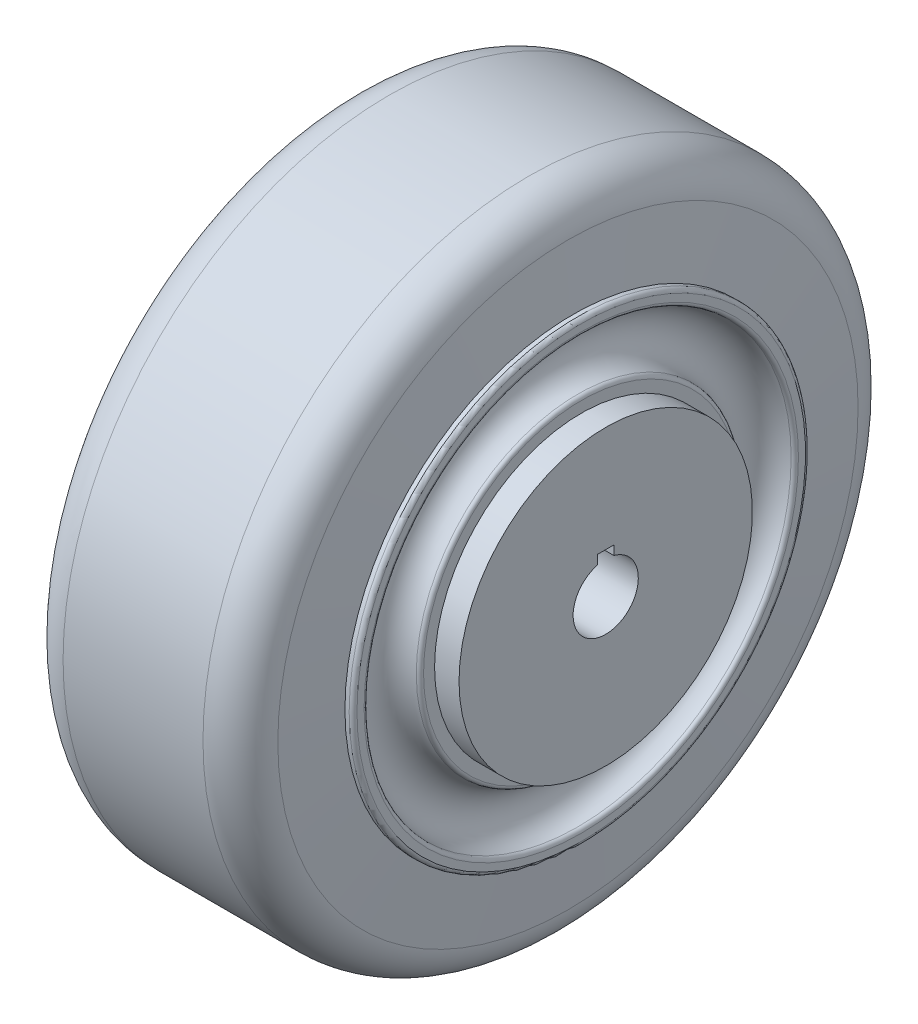
ISO-10303-21;
HEADER;
FILE_DESCRIPTION(('STEP AP214'),'2;1');
FILE_NAME('part.step','',(''),(''),'','','');
FILE_SCHEMA(('AUTOMOTIVE_DESIGN { 1 0 10303 214 1 1 1 1 }'));
ENDSEC;
DATA;
#1=APPLICATION_CONTEXT('core data for automotive mechanical design processes');
#2=APPLICATION_PROTOCOL_DEFINITION('international standard','automotive_design',2000,#1);
#3=PRODUCT_CONTEXT('',#1,'mechanical');
#4=PRODUCT('Part','Part','',(#3));
#5=PRODUCT_RELATED_PRODUCT_CATEGORY('part','',(#4));
#6=PRODUCT_DEFINITION_FORMATION('','',#4);
#7=PRODUCT_DEFINITION_CONTEXT('part definition',#1,'design');
#8=PRODUCT_DEFINITION('design','',#6,#7);
#9=PRODUCT_DEFINITION_SHAPE('','',#8);
#10=(LENGTH_UNIT() NAMED_UNIT(*) SI_UNIT(.MILLI.,.METRE.));
#11=(NAMED_UNIT(*) PLANE_ANGLE_UNIT() SI_UNIT($,.RADIAN.));
#12=(NAMED_UNIT(*) SI_UNIT($,.STERADIAN.) SOLID_ANGLE_UNIT());
#13=UNCERTAINTY_MEASURE_WITH_UNIT(LENGTH_MEASURE(1.E-05),#10,'distance_accuracy_value','');
#14=(GEOMETRIC_REPRESENTATION_CONTEXT(3) GLOBAL_UNCERTAINTY_ASSIGNED_CONTEXT((#13)) GLOBAL_UNIT_ASSIGNED_CONTEXT((#10,
#11,#12)) REPRESENTATION_CONTEXT('',''));
#15=CARTESIAN_POINT('',(0.,0.,0.));
#16=DIRECTION('',(0.,0.,1.));
#17=DIRECTION('',(1.,0.,0.));
#18=AXIS2_PLACEMENT_3D('',#15,#16,#17);
#19=CARTESIAN_POINT('',(0.,0.,0.));
#20=DIRECTION('',(-1.,0.,0.));
#21=DIRECTION('',(0.,0.,1.));
#22=AXIS2_PLACEMENT_3D('',#19,#20,#21);
#23=CYLINDRICAL_SURFACE('',#22,6.35);
#24=CARTESIAN_POINT('',(0.,0.,0.));
#25=DIRECTION('',(-1.,0.,0.));
#26=DIRECTION('',(0.,0.,1.));
#27=AXIS2_PLACEMENT_3D('',#24,#25,#26);
#28=CIRCLE('',#27,6.35);
#29=CARTESIAN_POINT('',(0.,6.14836106210428,-1.5875));
#30=VERTEX_POINT('',#29);
#31=CARTESIAN_POINT('',(0.,6.14836106210427,1.5875));
#32=VERTEX_POINT('',#31);
#33=EDGE_CURVE('E104',#30,#32,#28,.T.);
#34=ORIENTED_EDGE('',*,*,#33,.T.);
#35=DIRECTION('',(-1.,0.,0.));
#36=VECTOR('',#35,1.);
#37=CARTESIAN_POINT('',(0.,6.14836106210428,1.5875));
#38=LINE('',#37,#36);
#39=CARTESIAN_POINT('',(57.15,6.14836106210428,1.5875));
#40=VERTEX_POINT('',#39);
#41=EDGE_CURVE('E102',#32,#40,#38,.F.);
#42=ORIENTED_EDGE('',*,*,#41,.T.);
#43=CARTESIAN_POINT('',(57.15,0.,0.));
#44=DIRECTION('',(-1.,0.,0.));
#45=DIRECTION('',(0.,0.,1.));
#46=AXIS2_PLACEMENT_3D('',#43,#44,#45);
#47=CIRCLE('',#46,6.35000000000001);
#48=CARTESIAN_POINT('',(57.15,6.14836106210428,-1.5875));
#49=VERTEX_POINT('',#48);
#50=EDGE_CURVE('E90',#49,#40,#47,.T.);
#51=ORIENTED_EDGE('',*,*,#50,.F.);
#52=DIRECTION('',(-1.,0.,0.));
#53=VECTOR('',#52,1.);
#54=CARTESIAN_POINT('',(0.,6.14836106210428,-1.5875));
#55=LINE('',#54,#53);
#56=EDGE_CURVE('E98',#49,#30,#55,.T.);
#57=ORIENTED_EDGE('',*,*,#56,.T.);
#58=EDGE_LOOP('',(#34,#42,#51,#57));
#59=FACE_BOUND('',#58,.T.);
#60=ADVANCED_FACE('F35',(#59),#23,.F.);
#61=CARTESIAN_POINT('',(57.15,28.575,0.));
#62=DIRECTION('',(-1.,0.,0.));
#63=DIRECTION('',(0.,0.,1.));
#64=AXIS2_PLACEMENT_3D('',#61,#62,#63);
#65=PLANE('',#64);
#66=ORIENTED_EDGE('',*,*,#50,.T.);
#67=DIRECTION('',(0.,1.,0.));
#68=VECTOR('',#67,1.);
#69=CARTESIAN_POINT('',(57.15,4.7625,1.5875));
#70=LINE('',#69,#68);
#71=CARTESIAN_POINT('',(57.15,7.9375,1.5875));
#72=VERTEX_POINT('',#71);
#73=EDGE_CURVE('E57',#40,#72,#70,.T.);
#74=ORIENTED_EDGE('',*,*,#73,.T.);
#75=DIRECTION('',(0.,0.,-1.));
#76=VECTOR('',#75,1.);
#77=CARTESIAN_POINT('',(57.15,7.9375,1.5875));
#78=LINE('',#77,#76);
#79=CARTESIAN_POINT('',(57.15,7.9375,-1.5875));
#80=VERTEX_POINT('',#79);
#81=EDGE_CURVE('E80',#72,#80,#78,.T.);
#82=ORIENTED_EDGE('',*,*,#81,.T.);
#83=DIRECTION('',(0.,-1.,0.));
#84=VECTOR('',#83,1.);
#85=CARTESIAN_POINT('',(57.15,4.7625,-1.5875));
#86=LINE('',#85,#84);
#87=EDGE_CURVE('E77',#80,#49,#86,.T.);
#88=ORIENTED_EDGE('',*,*,#87,.T.);
#89=EDGE_LOOP('',(#66,#74,#82,#88));
#90=FACE_BOUND('',#89,.T.);
#91=CARTESIAN_POINT('',(57.15,0.,0.));
#92=DIRECTION('',(-1.,0.,0.));
#93=DIRECTION('',(0.,0.,1.));
#94=AXIS2_PLACEMENT_3D('',#91,#92,#93);
#95=CIRCLE('',#94,28.575);
#96=CARTESIAN_POINT('',(57.15,0.,28.575));
#97=VERTEX_POINT('',#96);
#98=EDGE_CURVE('E122',#97,#97,#95,.T.);
#99=ORIENTED_EDGE('',*,*,#98,.F.);
#100=EDGE_LOOP('',(#99));
#101=FACE_BOUND('',#100,.T.);
#102=ADVANCED_FACE('F87',(#90,#101),#65,.F.);
#103=CARTESIAN_POINT('',(0.,0.,0.));
#104=DIRECTION('',(-1.,0.,0.));
#105=DIRECTION('',(0.,0.,1.));
#106=AXIS2_PLACEMENT_3D('',#103,#104,#105);
#107=CYLINDRICAL_SURFACE('',#106,28.575);
#108=CARTESIAN_POINT('',(52.3875,0.,0.));
#109=DIRECTION('',(-1.,0.,0.));
#110=DIRECTION('',(0.,0.,1.));
#111=AXIS2_PLACEMENT_3D('',#108,#109,#110);
#112=CIRCLE('',#111,28.575);
#113=CARTESIAN_POINT('',(52.3875,0.,28.575));
#114=VERTEX_POINT('',#113);
#115=EDGE_CURVE('E119',#114,#114,#112,.T.);
#116=ORIENTED_EDGE('',*,*,#115,.F.);
#117=EDGE_LOOP('',(#116));
#118=FACE_BOUND('',#117,.T.);
#119=ORIENTED_EDGE('',*,*,#98,.T.);
#120=EDGE_LOOP('',(#119));
#121=FACE_BOUND('',#120,.T.);
#122=ADVANCED_FACE('F194',(#118,#121),#107,.T.);
#123=CARTESIAN_POINT('',(52.3875,28.575,0.));
#124=DIRECTION('',(-1.,0.,0.));
#125=DIRECTION('',(0.,0.,1.));
#126=AXIS2_PLACEMENT_3D('',#123,#124,#125);
#127=PLANE('',#126);
#128=CARTESIAN_POINT('',(52.3875,0.,0.));
#129=DIRECTION('',(-1.,0.,0.));
#130=DIRECTION('',(0.,0.,1.));
#131=AXIS2_PLACEMENT_3D('',#128,#129,#130);
#132=CIRCLE('',#131,30.7204088404964);
#133=CARTESIAN_POINT('',(52.3875,0.,30.7204088404964));
#134=VERTEX_POINT('',#133);
#135=EDGE_CURVE('E162',#134,#134,#132,.F.);
#136=ORIENTED_EDGE('',*,*,#135,.T.);
#137=EDGE_LOOP('',(#136));
#138=FACE_BOUND('',#137,.T.);
#139=ORIENTED_EDGE('',*,*,#115,.T.);
#140=EDGE_LOOP('',(#139));
#141=FACE_BOUND('',#140,.T.);
#142=ADVANCED_FACE('F231',(#138,#141),#127,.F.);
#143=CARTESIAN_POINT('',(52.3875,0.,0.));
#144=DIRECTION('',(-1.,0.,0.));
#145=DIRECTION('',(0.,0.,1.));
#146=AXIS2_PLACEMENT_3D('',#143,#144,#145);
#147=TOROIDAL_SURFACE('',#146,36.5125,5.08);
#148=CARTESIAN_POINT('',(51.7248913043478,0.,0.));
#149=DIRECTION('',(1.,0.,0.));
#150=DIRECTION('',(0.,0.,-1.));
#151=AXIS2_PLACEMENT_3D('',#148,#149,#150);
#152=CIRCLE('',#151,31.475898991736);
#153=CARTESIAN_POINT('',(51.7248913043478,0.,-31.475898991736));
#154=VERTEX_POINT('',#153);
#155=EDGE_CURVE('E159',#154,#154,#152,.F.);
#156=ORIENTED_EDGE('',*,*,#155,.T.);
#157=EDGE_LOOP('',(#156));
#158=FACE_BOUND('',#157,.T.);
#159=CARTESIAN_POINT('',(51.7248913043478,0.,0.));
#160=DIRECTION('',(1.,0.,0.));
#161=DIRECTION('',(0.,0.,-1.));
#162=AXIS2_PLACEMENT_3D('',#159,#160,#161);
#163=CIRCLE('',#162,41.549101008264);
#164=CARTESIAN_POINT('',(51.7248913043478,0.,-41.549101008264));
#165=VERTEX_POINT('',#164);
#166=EDGE_CURVE('E156',#165,#165,#163,.T.);
#167=ORIENTED_EDGE('',*,*,#166,.T.);
#168=EDGE_LOOP('',(#167));
#169=FACE_BOUND('',#168,.T.);
#170=ADVANCED_FACE('F227',(#158,#169),#147,.F.);
#171=CARTESIAN_POINT('',(52.3875,41.5925,0.));
#172=DIRECTION('',(-1.,0.,0.));
#173=DIRECTION('',(0.,0.,1.));
#174=AXIS2_PLACEMENT_3D('',#171,#172,#173);
#175=PLANE('',#174);
#176=CARTESIAN_POINT('',(52.3875,0.,0.));
#177=DIRECTION('',(-1.,0.,0.));
#178=DIRECTION('',(0.,0.,1.));
#179=AXIS2_PLACEMENT_3D('',#176,#177,#178);
#180=CIRCLE('',#179,42.3045911595036);
#181=CARTESIAN_POINT('',(52.3875,0.,42.3045911595036));
#182=VERTEX_POINT('',#181);
#183=EDGE_CURVE('E168',#182,#182,#180,.T.);
#184=ORIENTED_EDGE('',*,*,#183,.T.);
#185=EDGE_LOOP('',(#184));
#186=FACE_BOUND('',#185,.T.);
#187=CARTESIAN_POINT('',(52.3875,0.,0.));
#188=DIRECTION('',(-1.,0.,0.));
#189=DIRECTION('',(0.,0.,1.));
#190=AXIS2_PLACEMENT_3D('',#187,#188,#189);
#191=CIRCLE('',#190,43.688);
#192=CARTESIAN_POINT('',(52.3875,0.,43.688));
#193=VERTEX_POINT('',#192);
#194=EDGE_CURVE('E165',#193,#193,#191,.F.);
#195=ORIENTED_EDGE('',*,*,#194,.T.);
#196=EDGE_LOOP('',(#195));
#197=FACE_BOUND('',#196,.T.);
#198=ADVANCED_FACE('F230',(#186,#197),#175,.F.);
#199=CARTESIAN_POINT('',(0.,0.,0.));
#200=DIRECTION('',(-1.,0.,0.));
#201=DIRECTION('',(0.,0.,1.));
#202=AXIS2_PLACEMENT_3D('',#199,#200,#201);
#203=CYLINDRICAL_SURFACE('',#202,44.45);
#204=CARTESIAN_POINT('',(51.6255,0.,0.));
#205=DIRECTION('',(-1.,0.,0.));
#206=DIRECTION('',(0.,0.,1.));
#207=AXIS2_PLACEMENT_3D('',#204,#205,#206);
#208=CIRCLE('',#207,44.45);
#209=CARTESIAN_POINT('',(51.6255,0.,44.45));
#210=VERTEX_POINT('',#209);
#211=EDGE_CURVE('E43',#210,#210,#208,.T.);
#212=ORIENTED_EDGE('',*,*,#211,.T.);
#213=EDGE_LOOP('',(#212));
#214=FACE_BOUND('',#213,.T.);
#215=CARTESIAN_POINT('',(50.8,0.,0.));
#216=DIRECTION('',(-1.,0.,0.));
#217=DIRECTION('',(0.,0.,1.));
#218=AXIS2_PLACEMENT_3D('',#215,#216,#217);
#219=CIRCLE('',#218,44.45);
#220=CARTESIAN_POINT('',(50.8,0.,44.45));
#221=VERTEX_POINT('',#220);
#222=EDGE_CURVE('E116',#221,#221,#219,.T.);
#223=ORIENTED_EDGE('',*,*,#222,.F.);
#224=EDGE_LOOP('',(#223));
#225=FACE_BOUND('',#224,.T.);
#226=ADVANCED_FACE('F173',(#214,#225),#203,.T.);
#227=CARTESIAN_POINT('',(50.8,0.,0.));
#228=DIRECTION('',(-1.,0.,0.));
#229=DIRECTION('',(0.,0.,1.));
#230=AXIS2_PLACEMENT_3D('',#227,#228,#229);
#231=CONICAL_SURFACE('',#230,44.45,1.48765509490646);
#232=CARTESIAN_POINT('',(49.7947661202929,0.,0.));
#233=DIRECTION('',(1.,0.,0.));
#234=DIRECTION('',(0.,0.,-1.));
#235=AXIS2_PLACEMENT_3D('',#232,#233,#234);
#236=CIRCLE('',#235,56.5128065564855);
#237=CARTESIAN_POINT('',(49.7947661202929,0.,-56.5128065564855));
#238=VERTEX_POINT('',#237);
#239=EDGE_CURVE('E132',#238,#238,#236,.T.);
#240=ORIENTED_EDGE('',*,*,#239,.T.);
#241=EDGE_LOOP('',(#240));
#242=FACE_BOUND('',#241,.T.);
#243=ORIENTED_EDGE('',*,*,#222,.T.);
#244=EDGE_LOOP('',(#243));
#245=FACE_BOUND('',#244,.T.);
#246=ADVANCED_FACE('F243',(#242,#245),#231,.T.);
#247=CARTESIAN_POINT('',(0.,0.,0.));
#248=DIRECTION('',(-1.,0.,0.));
#249=DIRECTION('',(0.,0.,1.));
#250=AXIS2_PLACEMENT_3D('',#247,#248,#249);
#251=CYLINDRICAL_SURFACE('',#250,63.5);
#252=CARTESIAN_POINT('',(42.2010874424669,0.,0.));
#253=DIRECTION('',(1.,0.,0.));
#254=DIRECTION('',(0.,0.,-1.));
#255=AXIS2_PLACEMENT_3D('',#252,#253,#254);
#256=CIRCLE('',#255,63.5);
#257=CARTESIAN_POINT('',(42.2010874424669,0.,-63.5));
#258=VERTEX_POINT('',#257);
#259=EDGE_CURVE('E129',#258,#258,#256,.F.);
#260=ORIENTED_EDGE('',*,*,#259,.T.);
#261=EDGE_LOOP('',(#260));
#262=FACE_BOUND('',#261,.T.);
#263=CARTESIAN_POINT('',(14.9489125575331,0.,0.));
#264=DIRECTION('',(1.,0.,0.));
#265=DIRECTION('',(0.,0.,-1.));
#266=AXIS2_PLACEMENT_3D('',#263,#264,#265);
#267=CIRCLE('',#266,63.5);
#268=CARTESIAN_POINT('',(14.9489125575331,0.,-63.5));
#269=VERTEX_POINT('',#268);
#270=EDGE_CURVE('E126',#269,#269,#267,.T.);
#271=ORIENTED_EDGE('',*,*,#270,.T.);
#272=EDGE_LOOP('',(#271));
#273=FACE_BOUND('',#272,.T.);
#274=ADVANCED_FACE('F361',(#262,#273),#251,.T.);
#275=CARTESIAN_POINT('',(7.9375,0.,0.));
#276=DIRECTION('',(1.,0.,0.));
#277=DIRECTION('',(0.,0.,-1.));
#278=AXIS2_PLACEMENT_3D('',#275,#276,#277);
#279=CONICAL_SURFACE('',#278,63.5,1.48765509490646);
#280=CARTESIAN_POINT('',(7.35523387970713,0.,0.));
#281=DIRECTION('',(-1.,0.,0.));
#282=DIRECTION('',(0.,0.,1.));
#283=AXIS2_PLACEMENT_3D('',#280,#281,#282);
#284=CIRCLE('',#283,56.5128065564855);
#285=CARTESIAN_POINT('',(7.35523387970713,0.,56.5128065564855));
#286=VERTEX_POINT('',#285);
#287=EDGE_CURVE('E135',#286,#286,#284,.T.);
#288=ORIENTED_EDGE('',*,*,#287,.T.);
#289=EDGE_LOOP('',(#288));
#290=FACE_BOUND('',#289,.T.);
#291=CARTESIAN_POINT('',(6.35,0.,0.));
#292=DIRECTION('',(-1.,0.,0.));
#293=DIRECTION('',(0.,0.,1.));
#294=AXIS2_PLACEMENT_3D('',#291,#292,#293);
#295=CIRCLE('',#294,44.45);
#296=CARTESIAN_POINT('',(6.35,0.,44.45));
#297=VERTEX_POINT('',#296);
#298=EDGE_CURVE('E113',#297,#297,#295,.T.);
#299=ORIENTED_EDGE('',*,*,#298,.F.);
#300=EDGE_LOOP('',(#299));
#301=FACE_BOUND('',#300,.T.);
#302=ADVANCED_FACE('F286',(#290,#301),#279,.T.);
#303=CARTESIAN_POINT('',(0.,0.,0.));
#304=DIRECTION('',(-1.,0.,0.));
#305=DIRECTION('',(0.,0.,1.));
#306=AXIS2_PLACEMENT_3D('',#303,#304,#305);
#307=CYLINDRICAL_SURFACE('',#306,44.45);
#308=CARTESIAN_POINT('',(5.5245,0.,0.));
#309=DIRECTION('',(1.,0.,0.));
#310=DIRECTION('',(0.,0.,-1.));
#311=AXIS2_PLACEMENT_3D('',#308,#309,#310);
#312=CIRCLE('',#311,44.45);
#313=CARTESIAN_POINT('',(5.5245,0.,-44.45));
#314=VERTEX_POINT('',#313);
#315=EDGE_CURVE('E153',#314,#314,#312,.T.);
#316=ORIENTED_EDGE('',*,*,#315,.T.);
#317=EDGE_LOOP('',(#316));
#318=FACE_BOUND('',#317,.T.);
#319=ORIENTED_EDGE('',*,*,#298,.T.);
#320=EDGE_LOOP('',(#319));
#321=FACE_BOUND('',#320,.T.);
#322=ADVANCED_FACE('F280',(#318,#321),#307,.T.);
#323=CARTESIAN_POINT('',(4.7625,41.5925,0.));
#324=DIRECTION('',(1.,0.,0.));
#325=DIRECTION('',(0.,0.,-1.));
#326=AXIS2_PLACEMENT_3D('',#323,#324,#325);
#327=PLANE('',#326);
#328=CARTESIAN_POINT('',(4.7625,0.,0.));
#329=DIRECTION('',(1.,0.,0.));
#330=DIRECTION('',(0.,0.,-1.));
#331=AXIS2_PLACEMENT_3D('',#328,#329,#330);
#332=CIRCLE('',#331,42.3045911595036);
#333=CARTESIAN_POINT('',(4.7625,0.,-42.3045911595036));
#334=VERTEX_POINT('',#333);
#335=EDGE_CURVE('E150',#334,#334,#332,.T.);
#336=ORIENTED_EDGE('',*,*,#335,.T.);
#337=EDGE_LOOP('',(#336));
#338=FACE_BOUND('',#337,.T.);
#339=CARTESIAN_POINT('',(4.7625,0.,0.));
#340=DIRECTION('',(1.,0.,0.));
#341=DIRECTION('',(0.,0.,-1.));
#342=AXIS2_PLACEMENT_3D('',#339,#340,#341);
#343=CIRCLE('',#342,43.688);
#344=CARTESIAN_POINT('',(4.7625,0.,-43.688));
#345=VERTEX_POINT('',#344);
#346=EDGE_CURVE('E147',#345,#345,#343,.F.);
#347=ORIENTED_EDGE('',*,*,#346,.T.);
#348=EDGE_LOOP('',(#347));
#349=FACE_BOUND('',#348,.T.);
#350=ADVANCED_FACE('F285',(#338,#349),#327,.F.);
#351=CARTESIAN_POINT('',(4.7625,0.,0.));
#352=DIRECTION('',(-1.,0.,0.));
#353=DIRECTION('',(0.,0.,1.));
#354=AXIS2_PLACEMENT_3D('',#351,#352,#353);
#355=TOROIDAL_SURFACE('',#354,36.5125,5.08);
#356=CARTESIAN_POINT('',(5.42510869565218,0.,0.));
#357=DIRECTION('',(-1.,0.,0.));
#358=DIRECTION('',(0.,0.,1.));
#359=AXIS2_PLACEMENT_3D('',#356,#357,#358);
#360=CIRCLE('',#359,31.475898991736);
#361=CARTESIAN_POINT('',(5.42510869565218,0.,31.475898991736));
#362=VERTEX_POINT('',#361);
#363=EDGE_CURVE('E144',#362,#362,#360,.F.);
#364=ORIENTED_EDGE('',*,*,#363,.T.);
#365=EDGE_LOOP('',(#364));
#366=FACE_BOUND('',#365,.T.);
#367=CARTESIAN_POINT('',(5.42510869565218,0.,0.));
#368=DIRECTION('',(-1.,0.,0.));
#369=DIRECTION('',(0.,0.,1.));
#370=AXIS2_PLACEMENT_3D('',#367,#368,#369);
#371=CIRCLE('',#370,41.549101008264);
#372=CARTESIAN_POINT('',(5.42510869565218,0.,41.549101008264));
#373=VERTEX_POINT('',#372);
#374=EDGE_CURVE('E141',#373,#373,#371,.T.);
#375=ORIENTED_EDGE('',*,*,#374,.T.);
#376=EDGE_LOOP('',(#375));
#377=FACE_BOUND('',#376,.T.);
#378=ADVANCED_FACE('F297',(#366,#377),#355,.F.);
#379=CARTESIAN_POINT('',(4.7625,28.575,0.));
#380=DIRECTION('',(1.,0.,0.));
#381=DIRECTION('',(0.,0.,-1.));
#382=AXIS2_PLACEMENT_3D('',#379,#380,#381);
#383=PLANE('',#382);
#384=CARTESIAN_POINT('',(4.7625,0.,0.));
#385=DIRECTION('',(1.,0.,0.));
#386=DIRECTION('',(0.,0.,-1.));
#387=AXIS2_PLACEMENT_3D('',#384,#385,#386);
#388=CIRCLE('',#387,30.7204088404964);
#389=CARTESIAN_POINT('',(4.7625,0.,-30.7204088404964));
#390=VERTEX_POINT('',#389);
#391=EDGE_CURVE('E138',#390,#390,#388,.F.);
#392=ORIENTED_EDGE('',*,*,#391,.T.);
#393=EDGE_LOOP('',(#392));
#394=FACE_BOUND('',#393,.T.);
#395=CARTESIAN_POINT('',(4.7625,0.,0.));
#396=DIRECTION('',(-1.,0.,0.));
#397=DIRECTION('',(0.,0.,1.));
#398=AXIS2_PLACEMENT_3D('',#395,#396,#397);
#399=CIRCLE('',#398,28.575);
#400=CARTESIAN_POINT('',(4.7625,0.,28.575));
#401=VERTEX_POINT('',#400);
#402=EDGE_CURVE('E110',#401,#401,#399,.T.);
#403=ORIENTED_EDGE('',*,*,#402,.F.);
#404=EDGE_LOOP('',(#403));
#405=FACE_BOUND('',#404,.T.);
#406=ADVANCED_FACE('F307',(#394,#405),#383,.F.);
#407=CARTESIAN_POINT('',(0.,0.,0.));
#408=DIRECTION('',(-1.,0.,0.));
#409=DIRECTION('',(0.,0.,1.));
#410=AXIS2_PLACEMENT_3D('',#407,#408,#409);
#411=CYLINDRICAL_SURFACE('',#410,28.575);
#412=CARTESIAN_POINT('',(0.,0.,0.));
#413=DIRECTION('',(-1.,0.,0.));
#414=DIRECTION('',(0.,0.,1.));
#415=AXIS2_PLACEMENT_3D('',#412,#413,#414);
#416=CIRCLE('',#415,28.575);
#417=CARTESIAN_POINT('',(0.,0.,28.575));
#418=VERTEX_POINT('',#417);
#419=EDGE_CURVE('E107',#418,#418,#416,.T.);
#420=ORIENTED_EDGE('',*,*,#419,.F.);
#421=EDGE_LOOP('',(#420));
#422=FACE_BOUND('',#421,.T.);
#423=ORIENTED_EDGE('',*,*,#402,.T.);
#424=EDGE_LOOP('',(#423));
#425=FACE_BOUND('',#424,.T.);
#426=ADVANCED_FACE('F317',(#422,#425),#411,.T.);
#427=CARTESIAN_POINT('',(0.,6.35,0.));
#428=DIRECTION('',(1.,0.,0.));
#429=DIRECTION('',(0.,0.,-1.));
#430=AXIS2_PLACEMENT_3D('',#427,#428,#429);
#431=PLANE('',#430);
#432=DIRECTION('',(0.,0.,-1.));
#433=VECTOR('',#432,1.);
#434=CARTESIAN_POINT('',(0.,7.9375,1.5875));
#435=LINE('',#434,#433);
#436=CARTESIAN_POINT('',(0.,7.9375,1.5875));
#437=VERTEX_POINT('',#436);
#438=CARTESIAN_POINT('',(0.,7.9375,-1.5875));
#439=VERTEX_POINT('',#438);
#440=EDGE_CURVE('E93',#437,#439,#435,.T.);
#441=ORIENTED_EDGE('',*,*,#440,.F.);
#442=DIRECTION('',(0.,-1.,0.));
#443=VECTOR('',#442,1.);
#444=CARTESIAN_POINT('',(0.,6.35,1.5875));
#445=LINE('',#444,#443);
#446=EDGE_CURVE('E11',#437,#32,#445,.T.);
#447=ORIENTED_EDGE('',*,*,#446,.T.);
#448=ORIENTED_EDGE('',*,*,#33,.F.);
#449=DIRECTION('',(0.,-1.,0.));
#450=VECTOR('',#449,1.);
#451=CARTESIAN_POINT('',(0.,4.7625,-1.5875));
#452=LINE('',#451,#450);
#453=EDGE_CURVE('E91',#439,#30,#452,.T.);
#454=ORIENTED_EDGE('',*,*,#453,.F.);
#455=EDGE_LOOP('',(#441,#447,#448,#454));
#456=FACE_BOUND('',#455,.T.);
#457=ORIENTED_EDGE('',*,*,#419,.T.);
#458=EDGE_LOOP('',(#457));
#459=FACE_BOUND('',#458,.T.);
#460=ADVANCED_FACE('F202',(#456,#459),#431,.F.);
#461=CARTESIAN_POINT('',(42.2010874424669,0.,0.));
#462=DIRECTION('',(1.,0.,0.));
#463=DIRECTION('',(0.,0.,-1.));
#464=AXIS2_PLACEMENT_3D('',#461,#462,#463);
#465=TOROIDAL_SURFACE('',#464,55.88,7.62);
#466=ORIENTED_EDGE('',*,*,#239,.F.);
#467=EDGE_LOOP('',(#466));
#468=FACE_BOUND('',#467,.T.);
#469=ORIENTED_EDGE('',*,*,#259,.F.);
#470=EDGE_LOOP('',(#469));
#471=FACE_BOUND('',#470,.T.);
#472=ADVANCED_FACE('F198',(#468,#471),#465,.T.);
#473=CARTESIAN_POINT('',(14.9489125575331,0.,0.));
#474=DIRECTION('',(1.,0.,0.));
#475=DIRECTION('',(0.,0.,-1.));
#476=AXIS2_PLACEMENT_3D('',#473,#474,#475);
#477=TOROIDAL_SURFACE('',#476,55.88,7.62);
#478=ORIENTED_EDGE('',*,*,#270,.F.);
#479=EDGE_LOOP('',(#478));
#480=FACE_BOUND('',#479,.T.);
#481=ORIENTED_EDGE('',*,*,#287,.F.);
#482=EDGE_LOOP('',(#481));
#483=FACE_BOUND('',#482,.T.);
#484=ADVANCED_FACE('F201',(#480,#483),#477,.T.);
#485=CARTESIAN_POINT('',(5.5245,0.,0.));
#486=DIRECTION('',(-1.,0.,0.));
#487=DIRECTION('',(0.,0.,1.));
#488=AXIS2_PLACEMENT_3D('',#485,#486,#487);
#489=TOROIDAL_SURFACE('',#488,30.7204088404964,0.762);
#490=ORIENTED_EDGE('',*,*,#363,.F.);
#491=EDGE_LOOP('',(#490));
#492=FACE_BOUND('',#491,.T.);
#493=ORIENTED_EDGE('',*,*,#391,.F.);
#494=EDGE_LOOP('',(#493));
#495=FACE_BOUND('',#494,.T.);
#496=ADVANCED_FACE('F206',(#492,#495),#489,.T.);
#497=CARTESIAN_POINT('',(5.5245,0.,0.));
#498=DIRECTION('',(1.,0.,0.));
#499=DIRECTION('',(0.,0.,-1.));
#500=AXIS2_PLACEMENT_3D('',#497,#498,#499);
#501=TOROIDAL_SURFACE('',#500,42.3045911595036,0.762);
#502=ORIENTED_EDGE('',*,*,#335,.F.);
#503=EDGE_LOOP('',(#502));
#504=FACE_BOUND('',#503,.T.);
#505=ORIENTED_EDGE('',*,*,#374,.F.);
#506=EDGE_LOOP('',(#505));
#507=FACE_BOUND('',#506,.T.);
#508=ADVANCED_FACE('F210',(#504,#507),#501,.T.);
#509=CARTESIAN_POINT('',(5.5245,0.,0.));
#510=DIRECTION('',(1.,0.,0.));
#511=DIRECTION('',(0.,0.,-1.));
#512=AXIS2_PLACEMENT_3D('',#509,#510,#511);
#513=TOROIDAL_SURFACE('',#512,43.688,0.762);
#514=ORIENTED_EDGE('',*,*,#315,.F.);
#515=EDGE_LOOP('',(#514));
#516=FACE_BOUND('',#515,.T.);
#517=ORIENTED_EDGE('',*,*,#346,.F.);
#518=EDGE_LOOP('',(#517));
#519=FACE_BOUND('',#518,.T.);
#520=ADVANCED_FACE('F214',(#516,#519),#513,.T.);
#521=CARTESIAN_POINT('',(51.6255,0.,0.));
#522=DIRECTION('',(1.,0.,0.));
#523=DIRECTION('',(0.,0.,-1.));
#524=AXIS2_PLACEMENT_3D('',#521,#522,#523);
#525=TOROIDAL_SURFACE('',#524,30.7204088404964,0.762);
#526=ORIENTED_EDGE('',*,*,#135,.F.);
#527=EDGE_LOOP('',(#526));
#528=FACE_BOUND('',#527,.T.);
#529=ORIENTED_EDGE('',*,*,#155,.F.);
#530=EDGE_LOOP('',(#529));
#531=FACE_BOUND('',#530,.T.);
#532=ADVANCED_FACE('F185',(#528,#531),#525,.T.);
#533=CARTESIAN_POINT('',(51.6255,0.,0.));
#534=DIRECTION('',(-1.,0.,0.));
#535=DIRECTION('',(0.,0.,1.));
#536=AXIS2_PLACEMENT_3D('',#533,#534,#535);
#537=TOROIDAL_SURFACE('',#536,42.3045911595036,0.762);
#538=ORIENTED_EDGE('',*,*,#166,.F.);
#539=EDGE_LOOP('',(#538));
#540=FACE_BOUND('',#539,.T.);
#541=ORIENTED_EDGE('',*,*,#183,.F.);
#542=EDGE_LOOP('',(#541));
#543=FACE_BOUND('',#542,.T.);
#544=ADVANCED_FACE('F177',(#540,#543),#537,.T.);
#545=CARTESIAN_POINT('',(51.6255,0.,0.));
#546=DIRECTION('',(-1.,0.,0.));
#547=DIRECTION('',(0.,0.,1.));
#548=AXIS2_PLACEMENT_3D('',#545,#546,#547);
#549=TOROIDAL_SURFACE('',#548,43.688,0.762);
#550=ORIENTED_EDGE('',*,*,#194,.F.);
#551=EDGE_LOOP('',(#550));
#552=FACE_BOUND('',#551,.T.);
#553=ORIENTED_EDGE('',*,*,#211,.F.);
#554=EDGE_LOOP('',(#553));
#555=FACE_BOUND('',#554,.T.);
#556=ADVANCED_FACE('F37',(#552,#555),#549,.T.);
#557=CARTESIAN_POINT('',(57.15,4.7625,1.5875));
#558=DIRECTION('',(0.,0.,1.));
#559=DIRECTION('',(1.,0.,0.));
#560=AXIS2_PLACEMENT_3D('',#557,#558,#559);
#561=PLANE('',#560);
#562=ORIENTED_EDGE('',*,*,#446,.F.);
#563=DIRECTION('',(-1.,0.,0.));
#564=VECTOR('',#563,1.);
#565=CARTESIAN_POINT('',(57.15,7.9375,1.5875));
#566=LINE('',#565,#564);
#567=EDGE_CURVE('E50',#72,#437,#566,.T.);
#568=ORIENTED_EDGE('',*,*,#567,.F.);
#569=ORIENTED_EDGE('',*,*,#73,.F.);
#570=ORIENTED_EDGE('',*,*,#41,.F.);
#571=EDGE_LOOP('',(#562,#568,#569,#570));
#572=FACE_BOUND('',#571,.T.);
#573=ADVANCED_FACE('F74',(#572),#561,.F.);
#574=CARTESIAN_POINT('',(57.15,4.7625,-1.5875));
#575=DIRECTION('',(0.,0.,-1.));
#576=DIRECTION('',(0.,1.,0.));
#577=AXIS2_PLACEMENT_3D('',#574,#575,#576);
#578=PLANE('',#577);
#579=ORIENTED_EDGE('',*,*,#87,.F.);
#580=DIRECTION('',(-1.,0.,0.));
#581=VECTOR('',#580,1.);
#582=CARTESIAN_POINT('',(57.15,7.9375,-1.5875));
#583=LINE('',#582,#581);
#584=EDGE_CURVE('E76',#80,#439,#583,.T.);
#585=ORIENTED_EDGE('',*,*,#584,.T.);
#586=ORIENTED_EDGE('',*,*,#453,.T.);
#587=ORIENTED_EDGE('',*,*,#56,.F.);
#588=EDGE_LOOP('',(#579,#585,#586,#587));
#589=FACE_BOUND('',#588,.T.);
#590=ADVANCED_FACE('F183',(#589),#578,.F.);
#591=CARTESIAN_POINT('',(57.15,7.9375,1.5875));
#592=DIRECTION('',(0.,1.,0.));
#593=DIRECTION('',(0.,0.,1.));
#594=AXIS2_PLACEMENT_3D('',#591,#592,#593);
#595=PLANE('',#594);
#596=ORIENTED_EDGE('',*,*,#440,.T.);
#597=ORIENTED_EDGE('',*,*,#584,.F.);
#598=ORIENTED_EDGE('',*,*,#81,.F.);
#599=ORIENTED_EDGE('',*,*,#567,.T.);
#600=EDGE_LOOP('',(#596,#597,#598,#599));
#601=FACE_BOUND('',#600,.T.);
#602=ADVANCED_FACE('F81',(#601),#595,.F.);
#603=CLOSED_SHELL('',(#60,#102,#122,#142,#170,#198,#226,#246,#274,#302,#322,#350,#378,#406,#426,
#460,#472,#484,#496,#508,#520,#532,#544,#556,#573,#590,#602));
#604=MANIFOLD_SOLID_BREP('B2',#603);
#605=ADVANCED_BREP_SHAPE_REPRESENTATION('',(#18,#604),#14);
#606=SHAPE_DEFINITION_REPRESENTATION(#9,#605);
ENDSEC;
END-ISO-10303-21;
